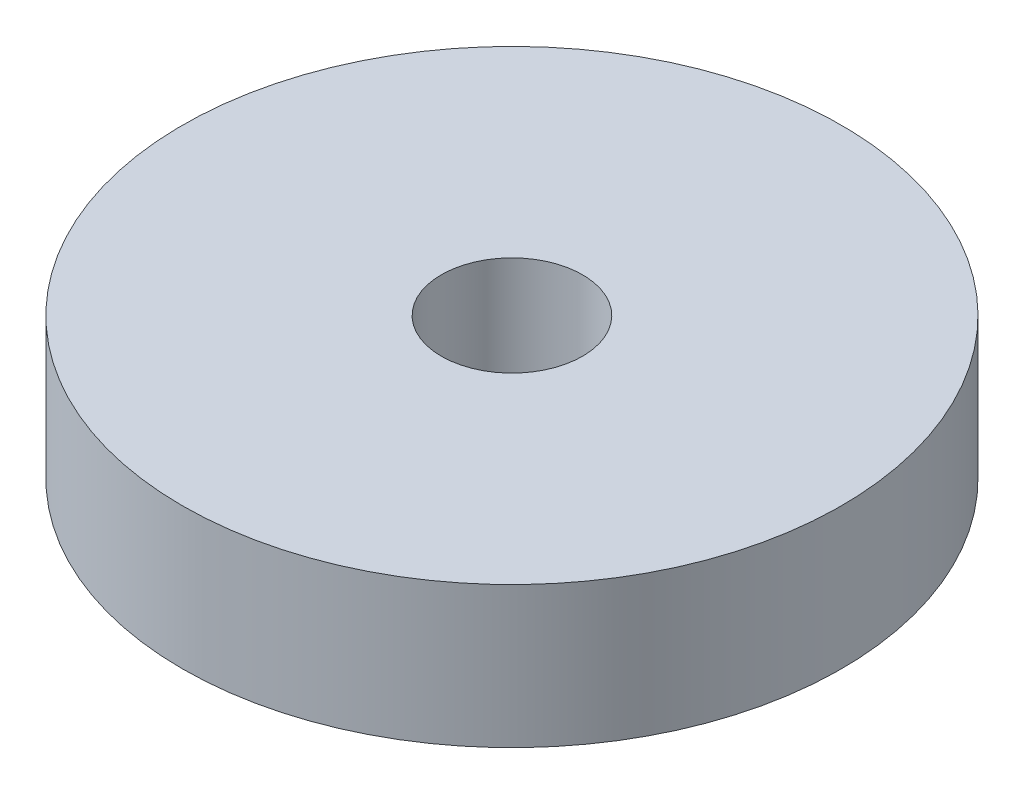
ISO-10303-21;
HEADER;
FILE_DESCRIPTION(('STEP AP214'),'2;1');
FILE_NAME('part.step','',(''),(''),'','','');
FILE_SCHEMA(('AUTOMOTIVE_DESIGN { 1 0 10303 214 1 1 1 1 }'));
ENDSEC;
DATA;
#1=APPLICATION_CONTEXT('core data for automotive mechanical design processes');
#2=APPLICATION_PROTOCOL_DEFINITION('international standard','automotive_design',2000,#1);
#3=PRODUCT_CONTEXT('',#1,'mechanical');
#4=PRODUCT('Part','Part','',(#3));
#5=PRODUCT_RELATED_PRODUCT_CATEGORY('part','',(#4));
#6=PRODUCT_DEFINITION_FORMATION('','',#4);
#7=PRODUCT_DEFINITION_CONTEXT('part definition',#1,'design');
#8=PRODUCT_DEFINITION('design','',#6,#7);
#9=PRODUCT_DEFINITION_SHAPE('','',#8);
#10=(LENGTH_UNIT() NAMED_UNIT(*) SI_UNIT(.MILLI.,.METRE.));
#11=(NAMED_UNIT(*) PLANE_ANGLE_UNIT() SI_UNIT($,.RADIAN.));
#12=(NAMED_UNIT(*) SI_UNIT($,.STERADIAN.) SOLID_ANGLE_UNIT());
#13=UNCERTAINTY_MEASURE_WITH_UNIT(LENGTH_MEASURE(1.E-05),#10,'distance_accuracy_value','');
#14=(GEOMETRIC_REPRESENTATION_CONTEXT(3) GLOBAL_UNCERTAINTY_ASSIGNED_CONTEXT((#13)) GLOBAL_UNIT_ASSIGNED_CONTEXT((#10,
#11,#12)) REPRESENTATION_CONTEXT('',''));
#15=CARTESIAN_POINT('',(0.,0.,0.));
#16=DIRECTION('',(0.,0.,1.));
#17=DIRECTION('',(1.,0.,0.));
#18=AXIS2_PLACEMENT_3D('',#15,#16,#17);
#19=CARTESIAN_POINT('',(0.,3.,0.));
#20=DIRECTION('',(0.,1.,0.));
#21=DIRECTION('',(0.,0.,1.));
#22=AXIS2_PLACEMENT_3D('',#19,#20,#21);
#23=PLANE('',#22);
#24=CARTESIAN_POINT('',(0.,3.,0.));
#25=DIRECTION('',(0.,1.,0.));
#26=DIRECTION('',(0.,0.,1.));
#27=AXIS2_PLACEMENT_3D('',#24,#25,#26);
#28=CIRCLE('',#27,7.);
#29=CARTESIAN_POINT('',(0.,3.,7.));
#30=VERTEX_POINT('',#29);
#31=EDGE_CURVE('E10',#30,#30,#28,.T.);
#32=ORIENTED_EDGE('',*,*,#31,.T.);
#33=EDGE_LOOP('',(#32));
#34=FACE_BOUND('',#33,.T.);
#35=CARTESIAN_POINT('',(0.,3.,0.));
#36=DIRECTION('',(0.,1.,0.));
#37=DIRECTION('',(0.,0.,1.));
#38=AXIS2_PLACEMENT_3D('',#35,#36,#37);
#39=CIRCLE('',#38,1.5);
#40=CARTESIAN_POINT('',(0.,3.,1.5));
#41=VERTEX_POINT('',#40);
#42=EDGE_CURVE('E42',#41,#41,#39,.T.);
#43=ORIENTED_EDGE('',*,*,#42,.F.);
#44=EDGE_LOOP('',(#43));
#45=FACE_BOUND('',#44,.T.);
#46=ADVANCED_FACE('F31',(#34,#45),#23,.T.);
#47=CARTESIAN_POINT('',(0.,0.,0.));
#48=DIRECTION('',(0.,1.,0.));
#49=DIRECTION('',(0.,0.,1.));
#50=AXIS2_PLACEMENT_3D('',#47,#48,#49);
#51=PLANE('',#50);
#52=CARTESIAN_POINT('',(0.,0.,0.));
#53=DIRECTION('',(0.,1.,0.));
#54=DIRECTION('',(0.,0.,1.));
#55=AXIS2_PLACEMENT_3D('',#52,#53,#54);
#56=CIRCLE('',#55,7.);
#57=CARTESIAN_POINT('',(0.,0.,7.));
#58=VERTEX_POINT('',#57);
#59=EDGE_CURVE('E35',#58,#58,#56,.T.);
#60=ORIENTED_EDGE('',*,*,#59,.F.);
#61=EDGE_LOOP('',(#60));
#62=FACE_BOUND('',#61,.T.);
#63=CARTESIAN_POINT('',(0.,0.,0.));
#64=DIRECTION('',(0.,1.,0.));
#65=DIRECTION('',(0.,0.,1.));
#66=AXIS2_PLACEMENT_3D('',#63,#64,#65);
#67=CIRCLE('',#66,1.5);
#68=CARTESIAN_POINT('',(0.,0.,1.5));
#69=VERTEX_POINT('',#68);
#70=EDGE_CURVE('E44',#69,#69,#67,.T.);
#71=ORIENTED_EDGE('',*,*,#70,.T.);
#72=EDGE_LOOP('',(#71));
#73=FACE_BOUND('',#72,.T.);
#74=ADVANCED_FACE('F54',(#62,#73),#51,.F.);
#75=CARTESIAN_POINT('',(0.,3.,0.));
#76=DIRECTION('',(0.,-1.,0.));
#77=DIRECTION('',(0.,0.,-1.));
#78=AXIS2_PLACEMENT_3D('',#75,#76,#77);
#79=CYLINDRICAL_SURFACE('',#78,7.);
#80=ORIENTED_EDGE('',*,*,#31,.F.);
#81=EDGE_LOOP('',(#80));
#82=FACE_BOUND('',#81,.T.);
#83=ORIENTED_EDGE('',*,*,#59,.T.);
#84=EDGE_LOOP('',(#83));
#85=FACE_BOUND('',#84,.T.);
#86=ADVANCED_FACE('F33',(#82,#85),#79,.T.);
#87=CARTESIAN_POINT('',(0.,3.,0.));
#88=DIRECTION('',(0.,-1.,0.));
#89=DIRECTION('',(0.,0.,-1.));
#90=AXIS2_PLACEMENT_3D('',#87,#88,#89);
#91=CYLINDRICAL_SURFACE('',#90,1.5);
#92=ORIENTED_EDGE('',*,*,#42,.T.);
#93=EDGE_LOOP('',(#92));
#94=FACE_BOUND('',#93,.T.);
#95=ORIENTED_EDGE('',*,*,#70,.F.);
#96=EDGE_LOOP('',(#95));
#97=FACE_BOUND('',#96,.T.);
#98=ADVANCED_FACE('F50',(#94,#97),#91,.F.);
#99=CLOSED_SHELL('',(#46,#74,#86,#98));
#100=MANIFOLD_SOLID_BREP('B2',#99);
#101=ADVANCED_BREP_SHAPE_REPRESENTATION('',(#18,#100),#14);
#102=SHAPE_DEFINITION_REPRESENTATION(#9,#101);
ENDSEC;
END-ISO-10303-21;
